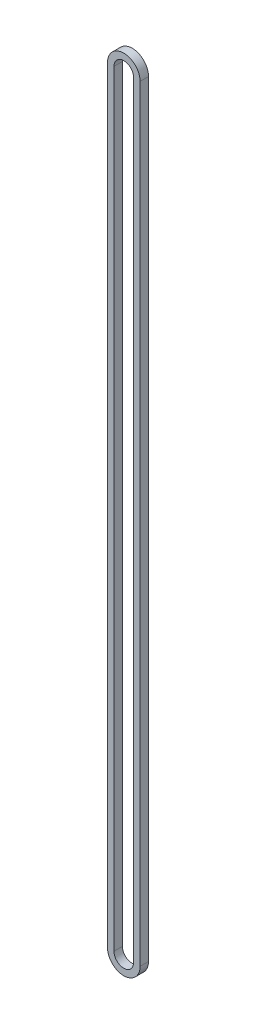
ISO-10303-21;
HEADER;
FILE_DESCRIPTION(('STEP AP214'),'2;1');
FILE_NAME('part.step','',(''),(''),'','','');
FILE_SCHEMA(('AUTOMOTIVE_DESIGN { 1 0 10303 214 1 1 1 1 }'));
ENDSEC;
DATA;
#1=APPLICATION_CONTEXT('core data for automotive mechanical design processes');
#2=APPLICATION_PROTOCOL_DEFINITION('international standard','automotive_design',2000,#1);
#3=PRODUCT_CONTEXT('',#1,'mechanical');
#4=PRODUCT('Part','Part','',(#3));
#5=PRODUCT_RELATED_PRODUCT_CATEGORY('part','',(#4));
#6=PRODUCT_DEFINITION_FORMATION('','',#4);
#7=PRODUCT_DEFINITION_CONTEXT('part definition',#1,'design');
#8=PRODUCT_DEFINITION('design','',#6,#7);
#9=PRODUCT_DEFINITION_SHAPE('','',#8);
#10=(LENGTH_UNIT() NAMED_UNIT(*) SI_UNIT(.MILLI.,.METRE.));
#11=(NAMED_UNIT(*) PLANE_ANGLE_UNIT() SI_UNIT($,.RADIAN.));
#12=(NAMED_UNIT(*) SI_UNIT($,.STERADIAN.) SOLID_ANGLE_UNIT());
#13=UNCERTAINTY_MEASURE_WITH_UNIT(LENGTH_MEASURE(1.E-05),#10,'distance_accuracy_value','');
#14=(GEOMETRIC_REPRESENTATION_CONTEXT(3) GLOBAL_UNCERTAINTY_ASSIGNED_CONTEXT((#13)) GLOBAL_UNIT_ASSIGNED_CONTEXT((#10,
#11,#12)) REPRESENTATION_CONTEXT('',''));
#15=CARTESIAN_POINT('',(0.,0.,0.));
#16=DIRECTION('',(0.,0.,1.));
#17=DIRECTION('',(1.,0.,0.));
#18=AXIS2_PLACEMENT_3D('',#15,#16,#17);
#19=CARTESIAN_POINT('',(0.,0.,5.8801));
#20=DIRECTION('',(0.,0.,1.));
#21=DIRECTION('',(1.,0.,0.));
#22=AXIS2_PLACEMENT_3D('',#19,#20,#21);
#23=PLANE('',#22);
#24=DIRECTION('',(0.,1.,0.));
#25=VECTOR('',#24,1.);
#26=CARTESIAN_POINT('',(-13.6398,0.,5.8801));
#27=LINE('',#26,#25);
#28=CARTESIAN_POINT('',(-13.6398,1066.8,5.8801));
#29=VERTEX_POINT('',#28);
#30=CARTESIAN_POINT('',(-13.6398,0.,5.8801));
#31=VERTEX_POINT('',#30);
#32=EDGE_CURVE('E110',#29,#31,#27,.F.);
#33=ORIENTED_EDGE('',*,*,#32,.F.);
#34=CARTESIAN_POINT('',(0.,1066.8,5.8801));
#35=DIRECTION('',(0.,0.,-1.));
#36=DIRECTION('',(-1.,0.,0.));
#37=AXIS2_PLACEMENT_3D('',#34,#35,#36);
#38=CIRCLE('',#37,13.6398);
#39=CARTESIAN_POINT('',(13.6398,1066.8,5.8801));
#40=VERTEX_POINT('',#39);
#41=EDGE_CURVE('E119',#29,#40,#38,.T.);
#42=ORIENTED_EDGE('',*,*,#41,.T.);
#43=DIRECTION('',(0.,1.,0.));
#44=VECTOR('',#43,1.);
#45=CARTESIAN_POINT('',(13.6398,0.,5.8801));
#46=LINE('',#45,#44);
#47=CARTESIAN_POINT('',(13.6398,0.,5.8801));
#48=VERTEX_POINT('',#47);
#49=EDGE_CURVE('E115',#48,#40,#46,.T.);
#50=ORIENTED_EDGE('',*,*,#49,.F.);
#51=CARTESIAN_POINT('',(0.,0.,5.8801));
#52=DIRECTION('',(0.,0.,-1.));
#53=DIRECTION('',(-1.,0.,0.));
#54=AXIS2_PLACEMENT_3D('',#51,#52,#53);
#55=CIRCLE('',#54,13.6398);
#56=EDGE_CURVE('E136',#48,#31,#55,.T.);
#57=ORIENTED_EDGE('',*,*,#56,.T.);
#58=EDGE_LOOP('',(#33,#42,#50,#57));
#59=FACE_BOUND('',#58,.T.);
#60=CARTESIAN_POINT('',(0.,1066.8,5.8801));
#61=DIRECTION('',(0.,0.,-1.));
#62=DIRECTION('',(-1.,0.,0.));
#63=AXIS2_PLACEMENT_3D('',#60,#61,#62);
#64=CIRCLE('',#63,22.733);
#65=CARTESIAN_POINT('',(-22.733,1066.8,5.8801));
#66=VERTEX_POINT('',#65);
#67=CARTESIAN_POINT('',(22.733,1066.8,5.8801));
#68=VERTEX_POINT('',#67);
#69=EDGE_CURVE('E20',#66,#68,#64,.T.);
#70=ORIENTED_EDGE('',*,*,#69,.F.);
#71=DIRECTION('',(0.,1.,0.));
#72=VECTOR('',#71,1.);
#73=CARTESIAN_POINT('',(-22.733,0.,5.8801));
#74=LINE('',#73,#72);
#75=CARTESIAN_POINT('',(-22.733,0.,5.8801));
#76=VERTEX_POINT('',#75);
#77=EDGE_CURVE('E106',#66,#76,#74,.F.);
#78=ORIENTED_EDGE('',*,*,#77,.T.);
#79=CARTESIAN_POINT('',(0.,0.,5.8801));
#80=DIRECTION('',(0.,0.,-1.));
#81=DIRECTION('',(-1.,0.,0.));
#82=AXIS2_PLACEMENT_3D('',#79,#80,#81);
#83=CIRCLE('',#82,22.733);
#84=CARTESIAN_POINT('',(22.733,0.,5.8801));
#85=VERTEX_POINT('',#84);
#86=EDGE_CURVE('E93',#85,#76,#83,.T.);
#87=ORIENTED_EDGE('',*,*,#86,.F.);
#88=DIRECTION('',(0.,1.,0.));
#89=VECTOR('',#88,1.);
#90=CARTESIAN_POINT('',(22.733,0.,5.8801));
#91=LINE('',#90,#89);
#92=EDGE_CURVE('E91',#85,#68,#91,.T.);
#93=ORIENTED_EDGE('',*,*,#92,.T.);
#94=EDGE_LOOP('',(#70,#78,#87,#93));
#95=FACE_BOUND('',#94,.T.);
#96=ADVANCED_FACE('F17',(#59,#95),#23,.T.);
#97=CARTESIAN_POINT('',(22.733,0.,5.8801));
#98=DIRECTION('',(-1.,0.,0.));
#99=DIRECTION('',(0.,0.,1.));
#100=AXIS2_PLACEMENT_3D('',#97,#98,#99);
#101=PLANE('',#100);
#102=DIRECTION('',(0.,0.,-1.));
#103=VECTOR('',#102,1.);
#104=CARTESIAN_POINT('',(22.733,1066.8,5.8801));
#105=LINE('',#104,#103);
#106=CARTESIAN_POINT('',(22.733,1066.8,-5.8801));
#107=VERTEX_POINT('',#106);
#108=EDGE_CURVE('E87',#68,#107,#105,.T.);
#109=ORIENTED_EDGE('',*,*,#108,.F.);
#110=ORIENTED_EDGE('',*,*,#92,.F.);
#111=DIRECTION('',(0.,0.,-1.));
#112=VECTOR('',#111,1.);
#113=CARTESIAN_POINT('',(22.733,0.,5.8801));
#114=LINE('',#113,#112);
#115=CARTESIAN_POINT('',(22.733,0.,-5.8801));
#116=VERTEX_POINT('',#115);
#117=EDGE_CURVE('E121',#116,#85,#114,.F.);
#118=ORIENTED_EDGE('',*,*,#117,.F.);
#119=DIRECTION('',(0.,1.,0.));
#120=VECTOR('',#119,1.);
#121=CARTESIAN_POINT('',(22.733,0.,-5.8801));
#122=LINE('',#121,#120);
#123=EDGE_CURVE('E101',#116,#107,#122,.T.);
#124=ORIENTED_EDGE('',*,*,#123,.T.);
#125=EDGE_LOOP('',(#109,#110,#118,#124));
#126=FACE_BOUND('',#125,.T.);
#127=ADVANCED_FACE('F100',(#126),#101,.F.);
#128=CARTESIAN_POINT('',(0.,1066.8,5.8801));
#129=DIRECTION('',(0.,0.,-1.));
#130=DIRECTION('',(-1.,0.,0.));
#131=AXIS2_PLACEMENT_3D('',#128,#129,#130);
#132=CYLINDRICAL_SURFACE('',#131,22.733);
#133=ORIENTED_EDGE('',*,*,#69,.T.);
#134=ORIENTED_EDGE('',*,*,#108,.T.);
#135=CARTESIAN_POINT('',(0.,1066.8,-5.8801));
#136=DIRECTION('',(0.,0.,-1.));
#137=DIRECTION('',(-1.,0.,0.));
#138=AXIS2_PLACEMENT_3D('',#135,#136,#137);
#139=CIRCLE('',#138,22.733);
#140=CARTESIAN_POINT('',(-22.733,1066.8,-5.8801));
#141=VERTEX_POINT('',#140);
#142=EDGE_CURVE('E133',#107,#141,#139,.F.);
#143=ORIENTED_EDGE('',*,*,#142,.T.);
#144=DIRECTION('',(0.,0.,-1.));
#145=VECTOR('',#144,1.);
#146=CARTESIAN_POINT('',(-22.733,1066.8,5.8801));
#147=LINE('',#146,#145);
#148=EDGE_CURVE('E89',#141,#66,#147,.F.);
#149=ORIENTED_EDGE('',*,*,#148,.T.);
#150=EDGE_LOOP('',(#133,#134,#143,#149));
#151=FACE_BOUND('',#150,.T.);
#152=ADVANCED_FACE('F84',(#151),#132,.T.);
#153=CARTESIAN_POINT('',(-22.733,0.,5.8801));
#154=DIRECTION('',(1.,0.,0.));
#155=DIRECTION('',(0.,0.,-1.));
#156=AXIS2_PLACEMENT_3D('',#153,#154,#155);
#157=PLANE('',#156);
#158=DIRECTION('',(0.,0.,-1.));
#159=VECTOR('',#158,1.);
#160=CARTESIAN_POINT('',(-22.733,0.,5.8801));
#161=LINE('',#160,#159);
#162=CARTESIAN_POINT('',(-22.733,0.,-5.8801));
#163=VERTEX_POINT('',#162);
#164=EDGE_CURVE('E114',#76,#163,#161,.T.);
#165=ORIENTED_EDGE('',*,*,#164,.F.);
#166=ORIENTED_EDGE('',*,*,#77,.F.);
#167=ORIENTED_EDGE('',*,*,#148,.F.);
#168=DIRECTION('',(0.,1.,0.));
#169=VECTOR('',#168,1.);
#170=CARTESIAN_POINT('',(-22.733,0.,-5.8801));
#171=LINE('',#170,#169);
#172=EDGE_CURVE('E132',#141,#163,#171,.F.);
#173=ORIENTED_EDGE('',*,*,#172,.T.);
#174=EDGE_LOOP('',(#165,#166,#167,#173));
#175=FACE_BOUND('',#174,.T.);
#176=ADVANCED_FACE('F201',(#175),#157,.F.);
#177=CARTESIAN_POINT('',(0.,0.,5.8801));
#178=DIRECTION('',(0.,0.,-1.));
#179=DIRECTION('',(-1.,0.,0.));
#180=AXIS2_PLACEMENT_3D('',#177,#178,#179);
#181=CYLINDRICAL_SURFACE('',#180,22.733);
#182=ORIENTED_EDGE('',*,*,#86,.T.);
#183=ORIENTED_EDGE('',*,*,#164,.T.);
#184=CARTESIAN_POINT('',(0.,0.,-5.8801));
#185=DIRECTION('',(0.,0.,-1.));
#186=DIRECTION('',(-1.,0.,0.));
#187=AXIS2_PLACEMENT_3D('',#184,#185,#186);
#188=CIRCLE('',#187,22.733);
#189=EDGE_CURVE('E128',#163,#116,#188,.F.);
#190=ORIENTED_EDGE('',*,*,#189,.T.);
#191=ORIENTED_EDGE('',*,*,#117,.T.);
#192=EDGE_LOOP('',(#182,#183,#190,#191));
#193=FACE_BOUND('',#192,.T.);
#194=ADVANCED_FACE('F198',(#193),#181,.T.);
#195=CARTESIAN_POINT('',(-13.6398,0.,5.8801));
#196=DIRECTION('',(1.,0.,0.));
#197=DIRECTION('',(0.,0.,-1.));
#198=AXIS2_PLACEMENT_3D('',#195,#196,#197);
#199=PLANE('',#198);
#200=ORIENTED_EDGE('',*,*,#32,.T.);
#201=DIRECTION('',(0.,0.,-1.));
#202=VECTOR('',#201,1.);
#203=CARTESIAN_POINT('',(-13.6398,0.,5.8801));
#204=LINE('',#203,#202);
#205=CARTESIAN_POINT('',(-13.6398,0.,-5.8801));
#206=VERTEX_POINT('',#205);
#207=EDGE_CURVE('E140',#31,#206,#204,.T.);
#208=ORIENTED_EDGE('',*,*,#207,.T.);
#209=DIRECTION('',(0.,1.,0.));
#210=VECTOR('',#209,1.);
#211=CARTESIAN_POINT('',(-13.6398,0.,-5.8801));
#212=LINE('',#211,#210);
#213=CARTESIAN_POINT('',(-13.6398,1066.8,-5.8801));
#214=VERTEX_POINT('',#213);
#215=EDGE_CURVE('E127',#206,#214,#212,.T.);
#216=ORIENTED_EDGE('',*,*,#215,.T.);
#217=DIRECTION('',(0.,0.,-1.));
#218=VECTOR('',#217,1.);
#219=CARTESIAN_POINT('',(-13.6398,1066.8,5.8801));
#220=LINE('',#219,#218);
#221=EDGE_CURVE('E113',#214,#29,#220,.F.);
#222=ORIENTED_EDGE('',*,*,#221,.T.);
#223=EDGE_LOOP('',(#200,#208,#216,#222));
#224=FACE_BOUND('',#223,.T.);
#225=ADVANCED_FACE('F181',(#224),#199,.T.);
#226=CARTESIAN_POINT('',(0.,1066.8,5.8801));
#227=DIRECTION('',(0.,0.,-1.));
#228=DIRECTION('',(-1.,0.,0.));
#229=AXIS2_PLACEMENT_3D('',#226,#227,#228);
#230=CYLINDRICAL_SURFACE('',#229,13.6398);
#231=DIRECTION('',(0.,0.,1.));
#232=VECTOR('',#231,1.);
#233=CARTESIAN_POINT('',(13.6398,1066.8,5.8801));
#234=LINE('',#233,#232);
#235=CARTESIAN_POINT('',(13.6398,1066.8,-5.8801));
#236=VERTEX_POINT('',#235);
#237=EDGE_CURVE('E118',#40,#236,#234,.F.);
#238=ORIENTED_EDGE('',*,*,#237,.F.);
#239=ORIENTED_EDGE('',*,*,#41,.F.);
#240=ORIENTED_EDGE('',*,*,#221,.F.);
#241=CARTESIAN_POINT('',(0.,1066.8,-5.8801));
#242=DIRECTION('',(0.,0.,-1.));
#243=DIRECTION('',(-1.,0.,0.));
#244=AXIS2_PLACEMENT_3D('',#241,#242,#243);
#245=CIRCLE('',#244,13.6398);
#246=EDGE_CURVE('E123',#214,#236,#245,.T.);
#247=ORIENTED_EDGE('',*,*,#246,.T.);
#248=EDGE_LOOP('',(#238,#239,#240,#247));
#249=FACE_BOUND('',#248,.T.);
#250=ADVANCED_FACE('F178',(#249),#230,.F.);
#251=CARTESIAN_POINT('',(13.6398,0.,5.8801));
#252=DIRECTION('',(-1.,0.,0.));
#253=DIRECTION('',(0.,0.,1.));
#254=AXIS2_PLACEMENT_3D('',#251,#252,#253);
#255=PLANE('',#254);
#256=ORIENTED_EDGE('',*,*,#49,.T.);
#257=ORIENTED_EDGE('',*,*,#237,.T.);
#258=DIRECTION('',(0.,1.,0.));
#259=VECTOR('',#258,1.);
#260=CARTESIAN_POINT('',(13.6398,0.,-5.8801));
#261=LINE('',#260,#259);
#262=CARTESIAN_POINT('',(13.6398,0.,-5.8801));
#263=VERTEX_POINT('',#262);
#264=EDGE_CURVE('E27',#236,#263,#261,.F.);
#265=ORIENTED_EDGE('',*,*,#264,.T.);
#266=DIRECTION('',(0.,0.,-1.));
#267=VECTOR('',#266,1.);
#268=CARTESIAN_POINT('',(13.6398,0.,5.8801));
#269=LINE('',#268,#267);
#270=EDGE_CURVE('E35',#263,#48,#269,.F.);
#271=ORIENTED_EDGE('',*,*,#270,.T.);
#272=EDGE_LOOP('',(#256,#257,#265,#271));
#273=FACE_BOUND('',#272,.T.);
#274=ADVANCED_FACE('F171',(#273),#255,.T.);
#275=CARTESIAN_POINT('',(0.,0.,5.8801));
#276=DIRECTION('',(0.,0.,-1.));
#277=DIRECTION('',(-1.,0.,0.));
#278=AXIS2_PLACEMENT_3D('',#275,#276,#277);
#279=CYLINDRICAL_SURFACE('',#278,13.6398);
#280=ORIENTED_EDGE('',*,*,#207,.F.);
#281=ORIENTED_EDGE('',*,*,#56,.F.);
#282=ORIENTED_EDGE('',*,*,#270,.F.);
#283=CARTESIAN_POINT('',(0.,0.,-5.8801));
#284=DIRECTION('',(0.,0.,-1.));
#285=DIRECTION('',(-1.,0.,0.));
#286=AXIS2_PLACEMENT_3D('',#283,#284,#285);
#287=CIRCLE('',#286,13.6398);
#288=EDGE_CURVE('E11',#263,#206,#287,.T.);
#289=ORIENTED_EDGE('',*,*,#288,.T.);
#290=EDGE_LOOP('',(#280,#281,#282,#289));
#291=FACE_BOUND('',#290,.T.);
#292=ADVANCED_FACE('F183',(#291),#279,.F.);
#293=CARTESIAN_POINT('',(0.,0.,-5.8801));
#294=DIRECTION('',(0.,0.,1.));
#295=DIRECTION('',(1.,0.,0.));
#296=AXIS2_PLACEMENT_3D('',#293,#294,#295);
#297=PLANE('',#296);
#298=ORIENTED_EDGE('',*,*,#264,.F.);
#299=ORIENTED_EDGE('',*,*,#246,.F.);
#300=ORIENTED_EDGE('',*,*,#215,.F.);
#301=ORIENTED_EDGE('',*,*,#288,.F.);
#302=EDGE_LOOP('',(#298,#299,#300,#301));
#303=FACE_BOUND('',#302,.T.);
#304=ORIENTED_EDGE('',*,*,#172,.F.);
#305=ORIENTED_EDGE('',*,*,#142,.F.);
#306=ORIENTED_EDGE('',*,*,#123,.F.);
#307=ORIENTED_EDGE('',*,*,#189,.F.);
#308=EDGE_LOOP('',(#304,#305,#306,#307));
#309=FACE_BOUND('',#308,.T.);
#310=ADVANCED_FACE('F175',(#303,#309),#297,.F.);
#311=CLOSED_SHELL('',(#96,#127,#152,#176,#194,#225,#250,#274,#292,#310));
#312=MANIFOLD_SOLID_BREP('B1',#311);
#313=ADVANCED_BREP_SHAPE_REPRESENTATION('',(#18,#312),#14);
#314=SHAPE_DEFINITION_REPRESENTATION(#9,#313);
ENDSEC;
END-ISO-10303-21;
